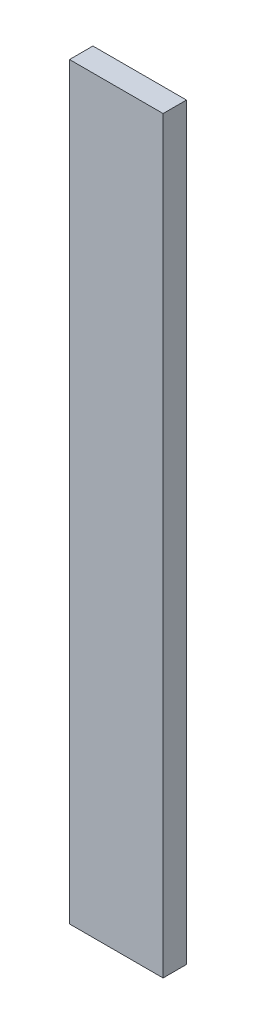
ISO-10303-21;
HEADER;
FILE_DESCRIPTION(('STEP AP214'),'2;1');
FILE_NAME('part.step','',(''),(''),'','','');
FILE_SCHEMA(('AUTOMOTIVE_DESIGN { 1 0 10303 214 1 1 1 1 }'));
ENDSEC;
DATA;
#1=APPLICATION_CONTEXT('core data for automotive mechanical design processes');
#2=APPLICATION_PROTOCOL_DEFINITION('international standard','automotive_design',2000,#1);
#3=PRODUCT_CONTEXT('',#1,'mechanical');
#4=PRODUCT('Part','Part','',(#3));
#5=PRODUCT_RELATED_PRODUCT_CATEGORY('part','',(#4));
#6=PRODUCT_DEFINITION_FORMATION('','',#4);
#7=PRODUCT_DEFINITION_CONTEXT('part definition',#1,'design');
#8=PRODUCT_DEFINITION('design','',#6,#7);
#9=PRODUCT_DEFINITION_SHAPE('','',#8);
#10=(LENGTH_UNIT() NAMED_UNIT(*) SI_UNIT(.MILLI.,.METRE.));
#11=(NAMED_UNIT(*) PLANE_ANGLE_UNIT() SI_UNIT($,.RADIAN.));
#12=(NAMED_UNIT(*) SI_UNIT($,.STERADIAN.) SOLID_ANGLE_UNIT());
#13=UNCERTAINTY_MEASURE_WITH_UNIT(LENGTH_MEASURE(1.E-05),#10,'distance_accuracy_value','');
#14=(GEOMETRIC_REPRESENTATION_CONTEXT(3) GLOBAL_UNCERTAINTY_ASSIGNED_CONTEXT((#13)) GLOBAL_UNIT_ASSIGNED_CONTEXT((#10,
#11,#12)) REPRESENTATION_CONTEXT('',''));
#15=CARTESIAN_POINT('',(0.,0.,0.));
#16=DIRECTION('',(0.,0.,1.));
#17=DIRECTION('',(1.,0.,0.));
#18=AXIS2_PLACEMENT_3D('',#15,#16,#17);
#19=CARTESIAN_POINT('',(12.7,101.6,6.35));
#20=DIRECTION('',(-1.,0.,0.));
#21=DIRECTION('',(0.,-1.,0.));
#22=AXIS2_PLACEMENT_3D('',#19,#20,#21);
#23=PLANE('',#22);
#24=DIRECTION('',(0.,1.,0.));
#25=VECTOR('',#24,1.);
#26=CARTESIAN_POINT('',(12.7,101.6,0.));
#27=LINE('',#26,#25);
#28=CARTESIAN_POINT('',(12.7,-101.6,0.));
#29=VERTEX_POINT('',#28);
#30=CARTESIAN_POINT('',(12.7,101.6,0.));
#31=VERTEX_POINT('',#30);
#32=EDGE_CURVE('E107',#29,#31,#27,.T.);
#33=ORIENTED_EDGE('',*,*,#32,.T.);
#34=DIRECTION('',(0.,0.,-1.));
#35=VECTOR('',#34,1.);
#36=CARTESIAN_POINT('',(12.7,101.6,6.35));
#37=LINE('',#36,#35);
#38=CARTESIAN_POINT('',(12.7,101.6,6.35));
#39=VERTEX_POINT('',#38);
#40=EDGE_CURVE('E11',#39,#31,#37,.T.);
#41=ORIENTED_EDGE('',*,*,#40,.F.);
#42=DIRECTION('',(0.,1.,0.));
#43=VECTOR('',#42,1.);
#44=CARTESIAN_POINT('',(12.7,101.6,6.35));
#45=LINE('',#44,#43);
#46=CARTESIAN_POINT('',(12.7,-101.6,6.35));
#47=VERTEX_POINT('',#46);
#48=EDGE_CURVE('E91',#47,#39,#45,.T.);
#49=ORIENTED_EDGE('',*,*,#48,.F.);
#50=DIRECTION('',(0.,0.,-1.));
#51=VECTOR('',#50,1.);
#52=CARTESIAN_POINT('',(12.7,-101.6,6.35));
#53=LINE('',#52,#51);
#54=EDGE_CURVE('E103',#47,#29,#53,.T.);
#55=ORIENTED_EDGE('',*,*,#54,.T.);
#56=EDGE_LOOP('',(#33,#41,#49,#55));
#57=FACE_BOUND('',#56,.T.);
#58=ADVANCED_FACE('F39',(#57),#23,.F.);
#59=CARTESIAN_POINT('',(-12.7,101.6,6.35));
#60=DIRECTION('',(0.,-1.,0.));
#61=DIRECTION('',(0.,0.,-1.));
#62=AXIS2_PLACEMENT_3D('',#59,#60,#61);
#63=PLANE('',#62);
#64=DIRECTION('',(-1.,0.,0.));
#65=VECTOR('',#64,1.);
#66=CARTESIAN_POINT('',(-12.7,101.6,0.));
#67=LINE('',#66,#65);
#68=CARTESIAN_POINT('',(-12.7,101.6,0.));
#69=VERTEX_POINT('',#68);
#70=EDGE_CURVE('E96',#31,#69,#67,.T.);
#71=ORIENTED_EDGE('',*,*,#70,.T.);
#72=DIRECTION('',(0.,0.,-1.));
#73=VECTOR('',#72,1.);
#74=CARTESIAN_POINT('',(-12.7,101.6,6.35));
#75=LINE('',#74,#73);
#76=CARTESIAN_POINT('',(-12.7,101.6,6.35));
#77=VERTEX_POINT('',#76);
#78=EDGE_CURVE('E48',#77,#69,#75,.T.);
#79=ORIENTED_EDGE('',*,*,#78,.F.);
#80=DIRECTION('',(-1.,0.,0.));
#81=VECTOR('',#80,1.);
#82=CARTESIAN_POINT('',(-12.7,101.6,6.35));
#83=LINE('',#82,#81);
#84=EDGE_CURVE('E86',#39,#77,#83,.T.);
#85=ORIENTED_EDGE('',*,*,#84,.F.);
#86=ORIENTED_EDGE('',*,*,#40,.T.);
#87=EDGE_LOOP('',(#71,#79,#85,#86));
#88=FACE_BOUND('',#87,.T.);
#89=ADVANCED_FACE('F95',(#88),#63,.F.);
#90=CARTESIAN_POINT('',(-12.7,101.6,6.35));
#91=DIRECTION('',(1.,0.,0.));
#92=DIRECTION('',(0.,1.,0.));
#93=AXIS2_PLACEMENT_3D('',#90,#91,#92);
#94=PLANE('',#93);
#95=DIRECTION('',(0.,-1.,0.));
#96=VECTOR('',#95,1.);
#97=CARTESIAN_POINT('',(-12.7,101.6,0.));
#98=LINE('',#97,#96);
#99=CARTESIAN_POINT('',(-12.7,-101.6,0.));
#100=VERTEX_POINT('',#99);
#101=EDGE_CURVE('E73',#69,#100,#98,.T.);
#102=ORIENTED_EDGE('',*,*,#101,.T.);
#103=DIRECTION('',(0.,0.,-1.));
#104=VECTOR('',#103,1.);
#105=CARTESIAN_POINT('',(-12.7,-101.6,6.35));
#106=LINE('',#105,#104);
#107=CARTESIAN_POINT('',(-12.7,-101.6,6.35));
#108=VERTEX_POINT('',#107);
#109=EDGE_CURVE('E98',#108,#100,#106,.T.);
#110=ORIENTED_EDGE('',*,*,#109,.F.);
#111=DIRECTION('',(0.,-1.,0.));
#112=VECTOR('',#111,1.);
#113=CARTESIAN_POINT('',(-12.7,101.6,6.35));
#114=LINE('',#113,#112);
#115=EDGE_CURVE('E89',#77,#108,#114,.T.);
#116=ORIENTED_EDGE('',*,*,#115,.F.);
#117=ORIENTED_EDGE('',*,*,#78,.T.);
#118=EDGE_LOOP('',(#102,#110,#116,#117));
#119=FACE_BOUND('',#118,.T.);
#120=ADVANCED_FACE('F99',(#119),#94,.F.);
#121=CARTESIAN_POINT('',(-12.7,-101.6,6.35));
#122=DIRECTION('',(0.,1.,0.));
#123=DIRECTION('',(0.,0.,1.));
#124=AXIS2_PLACEMENT_3D('',#121,#122,#123);
#125=PLANE('',#124);
#126=DIRECTION('',(1.,0.,0.));
#127=VECTOR('',#126,1.);
#128=CARTESIAN_POINT('',(-12.7,-101.6,0.));
#129=LINE('',#128,#127);
#130=EDGE_CURVE('E79',#100,#29,#129,.T.);
#131=ORIENTED_EDGE('',*,*,#130,.T.);
#132=ORIENTED_EDGE('',*,*,#54,.F.);
#133=DIRECTION('',(1.,0.,0.));
#134=VECTOR('',#133,1.);
#135=CARTESIAN_POINT('',(-12.7,-101.6,6.35));
#136=LINE('',#135,#134);
#137=EDGE_CURVE('E56',#108,#47,#136,.T.);
#138=ORIENTED_EDGE('',*,*,#137,.F.);
#139=ORIENTED_EDGE('',*,*,#109,.T.);
#140=EDGE_LOOP('',(#131,#132,#138,#139));
#141=FACE_BOUND('',#140,.T.);
#142=ADVANCED_FACE('F120',(#141),#125,.F.);
#143=CARTESIAN_POINT('',(0.,0.,6.35));
#144=DIRECTION('',(0.,0.,1.));
#145=DIRECTION('',(1.,0.,0.));
#146=AXIS2_PLACEMENT_3D('',#143,#144,#145);
#147=PLANE('',#146);
#148=ORIENTED_EDGE('',*,*,#48,.T.);
#149=ORIENTED_EDGE('',*,*,#84,.T.);
#150=ORIENTED_EDGE('',*,*,#115,.T.);
#151=ORIENTED_EDGE('',*,*,#137,.T.);
#152=EDGE_LOOP('',(#148,#149,#150,#151));
#153=FACE_BOUND('',#152,.T.);
#154=ADVANCED_FACE('F87',(#153),#147,.T.);
#155=CARTESIAN_POINT('',(0.,0.,0.));
#156=DIRECTION('',(0.,0.,1.));
#157=DIRECTION('',(1.,0.,0.));
#158=AXIS2_PLACEMENT_3D('',#155,#156,#157);
#159=PLANE('',#158);
#160=ORIENTED_EDGE('',*,*,#32,.F.);
#161=ORIENTED_EDGE('',*,*,#130,.F.);
#162=ORIENTED_EDGE('',*,*,#101,.F.);
#163=ORIENTED_EDGE('',*,*,#70,.F.);
#164=EDGE_LOOP('',(#160,#161,#162,#163));
#165=FACE_BOUND('',#164,.T.);
#166=ADVANCED_FACE('F123',(#165),#159,.F.);
#167=CLOSED_SHELL('',(#58,#89,#120,#142,#154,#166));
#168=MANIFOLD_SOLID_BREP('B2',#167);
#169=ADVANCED_BREP_SHAPE_REPRESENTATION('',(#18,#168),#14);
#170=SHAPE_DEFINITION_REPRESENTATION(#9,#169);
ENDSEC;
END-ISO-10303-21;
